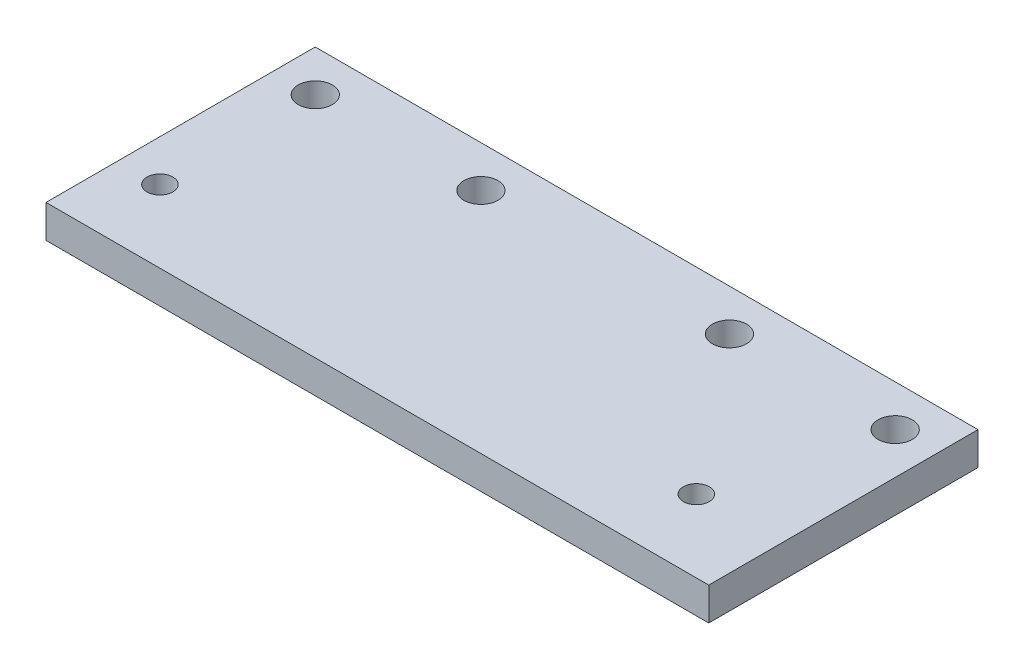
ISO-10303-21;
HEADER;
FILE_DESCRIPTION(('STEP AP214'),'2;1');
FILE_NAME('part.step','',(''),(''),'','','');
FILE_SCHEMA(('AUTOMOTIVE_DESIGN { 1 0 10303 214 1 1 1 1 }'));
ENDSEC;
DATA;
#1=APPLICATION_CONTEXT('core data for automotive mechanical design processes');
#2=APPLICATION_PROTOCOL_DEFINITION('international standard','automotive_design',2000,#1);
#3=PRODUCT_CONTEXT('',#1,'mechanical');
#4=PRODUCT('Part','Part','',(#3));
#5=PRODUCT_RELATED_PRODUCT_CATEGORY('part','',(#4));
#6=PRODUCT_DEFINITION_FORMATION('','',#4);
#7=PRODUCT_DEFINITION_CONTEXT('part definition',#1,'design');
#8=PRODUCT_DEFINITION('design','',#6,#7);
#9=PRODUCT_DEFINITION_SHAPE('','',#8);
#10=(LENGTH_UNIT() NAMED_UNIT(*) SI_UNIT(.MILLI.,.METRE.));
#11=(NAMED_UNIT(*) PLANE_ANGLE_UNIT() SI_UNIT($,.RADIAN.));
#12=(NAMED_UNIT(*) SI_UNIT($,.STERADIAN.) SOLID_ANGLE_UNIT());
#13=UNCERTAINTY_MEASURE_WITH_UNIT(LENGTH_MEASURE(1.E-05),#10,'distance_accuracy_value','');
#14=(GEOMETRIC_REPRESENTATION_CONTEXT(3) GLOBAL_UNCERTAINTY_ASSIGNED_CONTEXT((#13)) GLOBAL_UNIT_ASSIGNED_CONTEXT((#10,
#11,#12)) REPRESENTATION_CONTEXT('',''));
#15=CARTESIAN_POINT('',(0.,0.,0.));
#16=DIRECTION('',(0.,0.,1.));
#17=DIRECTION('',(1.,0.,0.));
#18=AXIS2_PLACEMENT_3D('',#15,#16,#17);
#19=CARTESIAN_POINT('',(64.,3.175,0.));
#20=DIRECTION('',(-1.,0.,0.));
#21=DIRECTION('',(0.,0.,1.));
#22=AXIS2_PLACEMENT_3D('',#19,#20,#21);
#23=PLANE('',#22);
#24=DIRECTION('',(0.,0.,-1.));
#25=VECTOR('',#24,1.);
#26=CARTESIAN_POINT('',(64.,0.,0.));
#27=LINE('',#26,#25);
#28=CARTESIAN_POINT('',(64.,0.,0.));
#29=VERTEX_POINT('',#28);
#30=CARTESIAN_POINT('',(64.,0.,-26.));
#31=VERTEX_POINT('',#30);
#32=EDGE_CURVE('E117',#29,#31,#27,.T.);
#33=ORIENTED_EDGE('',*,*,#32,.T.);
#34=DIRECTION('',(0.,-1.,0.));
#35=VECTOR('',#34,1.);
#36=CARTESIAN_POINT('',(64.,3.175,-26.));
#37=LINE('',#36,#35);
#38=CARTESIAN_POINT('',(64.,3.175,-26.));
#39=VERTEX_POINT('',#38);
#40=EDGE_CURVE('E11',#39,#31,#37,.T.);
#41=ORIENTED_EDGE('',*,*,#40,.F.);
#42=DIRECTION('',(0.,0.,-1.));
#43=VECTOR('',#42,1.);
#44=CARTESIAN_POINT('',(64.,3.175,0.));
#45=LINE('',#44,#43);
#46=CARTESIAN_POINT('',(64.,3.175,0.));
#47=VERTEX_POINT('',#46);
#48=EDGE_CURVE('E75',#47,#39,#45,.T.);
#49=ORIENTED_EDGE('',*,*,#48,.F.);
#50=DIRECTION('',(0.,-1.,0.));
#51=VECTOR('',#50,1.);
#52=CARTESIAN_POINT('',(64.,3.175,0.));
#53=LINE('',#52,#51);
#54=EDGE_CURVE('E107',#47,#29,#53,.T.);
#55=ORIENTED_EDGE('',*,*,#54,.T.);
#56=EDGE_LOOP('',(#33,#41,#49,#55));
#57=FACE_BOUND('',#56,.T.);
#58=ADVANCED_FACE('F35',(#57),#23,.F.);
#59=CARTESIAN_POINT('',(0.,3.175,-26.));
#60=DIRECTION('',(0.,0.,-1.));
#61=DIRECTION('',(-1.,0.,0.));
#62=AXIS2_PLACEMENT_3D('',#59,#60,#61);
#63=PLANE('',#62);
#64=DIRECTION('',(1.,0.,0.));
#65=VECTOR('',#64,1.);
#66=CARTESIAN_POINT('',(0.,0.,-26.));
#67=LINE('',#66,#65);
#68=CARTESIAN_POINT('',(0.,0.,-26.));
#69=VERTEX_POINT('',#68);
#70=EDGE_CURVE('E84',#69,#31,#67,.T.);
#71=ORIENTED_EDGE('',*,*,#70,.F.);
#72=DIRECTION('',(0.,-1.,0.));
#73=VECTOR('',#72,1.);
#74=CARTESIAN_POINT('',(0.,3.175,-26.));
#75=LINE('',#74,#73);
#76=CARTESIAN_POINT('',(0.,3.175,-26.));
#77=VERTEX_POINT('',#76);
#78=EDGE_CURVE('E44',#77,#69,#75,.T.);
#79=ORIENTED_EDGE('',*,*,#78,.F.);
#80=DIRECTION('',(1.,0.,0.));
#81=VECTOR('',#80,1.);
#82=CARTESIAN_POINT('',(0.,3.175,-26.));
#83=LINE('',#82,#81);
#84=EDGE_CURVE('E82',#77,#39,#83,.T.);
#85=ORIENTED_EDGE('',*,*,#84,.T.);
#86=ORIENTED_EDGE('',*,*,#40,.T.);
#87=EDGE_LOOP('',(#71,#79,#85,#86));
#88=FACE_BOUND('',#87,.T.);
#89=ADVANCED_FACE('F81',(#88),#63,.T.);
#90=CARTESIAN_POINT('',(0.,3.175,0.));
#91=DIRECTION('',(-1.,0.,0.));
#92=DIRECTION('',(0.,0.,1.));
#93=AXIS2_PLACEMENT_3D('',#90,#91,#92);
#94=PLANE('',#93);
#95=DIRECTION('',(0.,0.,-1.));
#96=VECTOR('',#95,1.);
#97=CARTESIAN_POINT('',(0.,0.,0.));
#98=LINE('',#97,#96);
#99=CARTESIAN_POINT('',(0.,0.,0.));
#100=VERTEX_POINT('',#99);
#101=EDGE_CURVE('E121',#100,#69,#98,.T.);
#102=ORIENTED_EDGE('',*,*,#101,.F.);
#103=DIRECTION('',(0.,-1.,0.));
#104=VECTOR('',#103,1.);
#105=CARTESIAN_POINT('',(0.,3.175,0.));
#106=LINE('',#105,#104);
#107=CARTESIAN_POINT('',(0.,3.175,0.));
#108=VERTEX_POINT('',#107);
#109=EDGE_CURVE('E67',#108,#100,#106,.T.);
#110=ORIENTED_EDGE('',*,*,#109,.F.);
#111=DIRECTION('',(0.,0.,-1.));
#112=VECTOR('',#111,1.);
#113=CARTESIAN_POINT('',(0.,3.175,0.));
#114=LINE('',#113,#112);
#115=EDGE_CURVE('E91',#108,#77,#114,.T.);
#116=ORIENTED_EDGE('',*,*,#115,.T.);
#117=ORIENTED_EDGE('',*,*,#78,.T.);
#118=EDGE_LOOP('',(#102,#110,#116,#117));
#119=FACE_BOUND('',#118,.T.);
#120=ADVANCED_FACE('F93',(#119),#94,.T.);
#121=CARTESIAN_POINT('',(4.,3.175,-7.));
#122=DIRECTION('',(0.,-1.,0.));
#123=DIRECTION('',(0.,0.,-1.));
#124=AXIS2_PLACEMENT_3D('',#121,#122,#123);
#125=CYLINDRICAL_SURFACE('',#124,1.25);
#126=CARTESIAN_POINT('',(4.,3.175,-7.));
#127=DIRECTION('',(0.,1.,0.));
#128=DIRECTION('',(0.,0.,1.));
#129=AXIS2_PLACEMENT_3D('',#126,#127,#128);
#130=CIRCLE('',#129,1.25);
#131=CARTESIAN_POINT('',(4.,3.175,-5.75));
#132=VERTEX_POINT('',#131);
#133=EDGE_CURVE('E101',#132,#132,#130,.T.);
#134=ORIENTED_EDGE('',*,*,#133,.T.);
#135=EDGE_LOOP('',(#134));
#136=FACE_BOUND('',#135,.T.);
#137=CARTESIAN_POINT('',(4.,0.,-7.));
#138=DIRECTION('',(0.,1.,0.));
#139=DIRECTION('',(0.,0.,1.));
#140=AXIS2_PLACEMENT_3D('',#137,#138,#139);
#141=CIRCLE('',#140,1.25);
#142=CARTESIAN_POINT('',(4.,0.,-5.75));
#143=VERTEX_POINT('',#142);
#144=EDGE_CURVE('E127',#143,#143,#141,.T.);
#145=ORIENTED_EDGE('',*,*,#144,.F.);
#146=EDGE_LOOP('',(#145));
#147=FACE_BOUND('',#146,.T.);
#148=ADVANCED_FACE('F257',(#136,#147),#125,.F.);
#149=CARTESIAN_POINT('',(55.8,3.175,-7.));
#150=DIRECTION('',(0.,-1.,0.));
#151=DIRECTION('',(0.,0.,-1.));
#152=AXIS2_PLACEMENT_3D('',#149,#150,#151);
#153=CYLINDRICAL_SURFACE('',#152,1.25);
#154=CARTESIAN_POINT('',(55.8,3.175,-7.));
#155=DIRECTION('',(0.,1.,0.));
#156=DIRECTION('',(0.,0.,1.));
#157=AXIS2_PLACEMENT_3D('',#154,#155,#156);
#158=CIRCLE('',#157,1.25);
#159=CARTESIAN_POINT('',(55.8,3.175,-5.75));
#160=VERTEX_POINT('',#159);
#161=EDGE_CURVE('E95',#160,#160,#158,.T.);
#162=ORIENTED_EDGE('',*,*,#161,.T.);
#163=EDGE_LOOP('',(#162));
#164=FACE_BOUND('',#163,.T.);
#165=CARTESIAN_POINT('',(55.8,0.,-7.));
#166=DIRECTION('',(0.,1.,0.));
#167=DIRECTION('',(0.,0.,1.));
#168=AXIS2_PLACEMENT_3D('',#165,#166,#167);
#169=CIRCLE('',#168,1.25);
#170=CARTESIAN_POINT('',(55.8,0.,-5.75));
#171=VERTEX_POINT('',#170);
#172=EDGE_CURVE('E124',#171,#171,#169,.T.);
#173=ORIENTED_EDGE('',*,*,#172,.F.);
#174=EDGE_LOOP('',(#173));
#175=FACE_BOUND('',#174,.T.);
#176=ADVANCED_FACE('F249',(#164,#175),#153,.F.);
#177=CARTESIAN_POINT('',(0.,3.175,0.));
#178=DIRECTION('',(0.,0.,-1.));
#179=DIRECTION('',(-1.,0.,0.));
#180=AXIS2_PLACEMENT_3D('',#177,#178,#179);
#181=PLANE('',#180);
#182=DIRECTION('',(1.,0.,0.));
#183=VECTOR('',#182,1.);
#184=CARTESIAN_POINT('',(0.,0.,0.));
#185=LINE('',#184,#183);
#186=EDGE_CURVE('E70',#100,#29,#185,.T.);
#187=ORIENTED_EDGE('',*,*,#186,.T.);
#188=ORIENTED_EDGE('',*,*,#54,.F.);
#189=DIRECTION('',(1.,0.,0.));
#190=VECTOR('',#189,1.);
#191=CARTESIAN_POINT('',(0.,3.175,0.));
#192=LINE('',#191,#190);
#193=EDGE_CURVE('E52',#108,#47,#192,.T.);
#194=ORIENTED_EDGE('',*,*,#193,.F.);
#195=ORIENTED_EDGE('',*,*,#109,.T.);
#196=EDGE_LOOP('',(#187,#188,#194,#195));
#197=FACE_BOUND('',#196,.T.);
#198=ADVANCED_FACE('F172',(#197),#181,.F.);
#199=CARTESIAN_POINT('',(4.,3.175,-22.));
#200=DIRECTION('',(0.,-1.,0.));
#201=DIRECTION('',(0.,0.,-1.));
#202=AXIS2_PLACEMENT_3D('',#199,#200,#201);
#203=CYLINDRICAL_SURFACE('',#202,1.65);
#204=CARTESIAN_POINT('',(4.,3.175,-22.));
#205=DIRECTION('',(0.,1.,0.));
#206=DIRECTION('',(0.,0.,1.));
#207=AXIS2_PLACEMENT_3D('',#204,#205,#206);
#208=CIRCLE('',#207,1.65);
#209=CARTESIAN_POINT('',(4.,3.175,-20.35));
#210=VERTEX_POINT('',#209);
#211=EDGE_CURVE('E188',#210,#210,#208,.T.);
#212=ORIENTED_EDGE('',*,*,#211,.T.);
#213=EDGE_LOOP('',(#212));
#214=FACE_BOUND('',#213,.T.);
#215=CARTESIAN_POINT('',(4.,0.,-22.));
#216=DIRECTION('',(0.,1.,0.));
#217=DIRECTION('',(0.,0.,1.));
#218=AXIS2_PLACEMENT_3D('',#215,#216,#217);
#219=CIRCLE('',#218,1.65);
#220=CARTESIAN_POINT('',(4.,0.,-20.35));
#221=VERTEX_POINT('',#220);
#222=EDGE_CURVE('E114',#221,#221,#219,.T.);
#223=ORIENTED_EDGE('',*,*,#222,.F.);
#224=EDGE_LOOP('',(#223));
#225=FACE_BOUND('',#224,.T.);
#226=ADVANCED_FACE('F170',(#214,#225),#203,.F.);
#227=CARTESIAN_POINT('',(20.,3.175,-22.));
#228=DIRECTION('',(0.,-1.,0.));
#229=DIRECTION('',(0.,0.,-1.));
#230=AXIS2_PLACEMENT_3D('',#227,#228,#229);
#231=CYLINDRICAL_SURFACE('',#230,1.65);
#232=CARTESIAN_POINT('',(20.,3.175,-22.));
#233=DIRECTION('',(0.,1.,0.));
#234=DIRECTION('',(0.,0.,1.));
#235=AXIS2_PLACEMENT_3D('',#232,#233,#234);
#236=CIRCLE('',#235,1.65);
#237=CARTESIAN_POINT('',(20.,3.175,-20.35));
#238=VERTEX_POINT('',#237);
#239=EDGE_CURVE('E181',#238,#238,#236,.T.);
#240=ORIENTED_EDGE('',*,*,#239,.T.);
#241=EDGE_LOOP('',(#240));
#242=FACE_BOUND('',#241,.T.);
#243=CARTESIAN_POINT('',(20.,0.,-22.));
#244=DIRECTION('',(0.,1.,0.));
#245=DIRECTION('',(0.,0.,1.));
#246=AXIS2_PLACEMENT_3D('',#243,#244,#245);
#247=CIRCLE('',#246,1.65);
#248=CARTESIAN_POINT('',(20.,0.,-20.35));
#249=VERTEX_POINT('',#248);
#250=EDGE_CURVE('E111',#249,#249,#247,.T.);
#251=ORIENTED_EDGE('',*,*,#250,.F.);
#252=EDGE_LOOP('',(#251));
#253=FACE_BOUND('',#252,.T.);
#254=ADVANCED_FACE('F159',(#242,#253),#231,.F.);
#255=CARTESIAN_POINT('',(44.,3.175,-22.));
#256=DIRECTION('',(0.,-1.,0.));
#257=DIRECTION('',(0.,0.,-1.));
#258=AXIS2_PLACEMENT_3D('',#255,#256,#257);
#259=CYLINDRICAL_SURFACE('',#258,1.65);
#260=CARTESIAN_POINT('',(44.,3.175,-22.));
#261=DIRECTION('',(0.,1.,0.));
#262=DIRECTION('',(0.,0.,1.));
#263=AXIS2_PLACEMENT_3D('',#260,#261,#262);
#264=CIRCLE('',#263,1.65);
#265=CARTESIAN_POINT('',(44.,3.175,-20.35));
#266=VERTEX_POINT('',#265);
#267=EDGE_CURVE('E133',#266,#266,#264,.T.);
#268=ORIENTED_EDGE('',*,*,#267,.T.);
#269=EDGE_LOOP('',(#268));
#270=FACE_BOUND('',#269,.T.);
#271=CARTESIAN_POINT('',(44.,0.,-22.));
#272=DIRECTION('',(0.,1.,0.));
#273=DIRECTION('',(0.,0.,1.));
#274=AXIS2_PLACEMENT_3D('',#271,#272,#273);
#275=CIRCLE('',#274,1.65);
#276=CARTESIAN_POINT('',(44.,0.,-20.35));
#277=VERTEX_POINT('',#276);
#278=EDGE_CURVE('E108',#277,#277,#275,.T.);
#279=ORIENTED_EDGE('',*,*,#278,.F.);
#280=EDGE_LOOP('',(#279));
#281=FACE_BOUND('',#280,.T.);
#282=ADVANCED_FACE('F37',(#270,#281),#259,.F.);
#283=CARTESIAN_POINT('',(60.,3.175,-22.));
#284=DIRECTION('',(0.,-1.,0.));
#285=DIRECTION('',(0.,0.,-1.));
#286=AXIS2_PLACEMENT_3D('',#283,#284,#285);
#287=CYLINDRICAL_SURFACE('',#286,1.65);
#288=CARTESIAN_POINT('',(60.,3.175,-22.));
#289=DIRECTION('',(0.,1.,0.));
#290=DIRECTION('',(0.,0.,1.));
#291=AXIS2_PLACEMENT_3D('',#288,#289,#290);
#292=CIRCLE('',#291,1.65);
#293=CARTESIAN_POINT('',(60.,3.175,-20.35));
#294=VERTEX_POINT('',#293);
#295=EDGE_CURVE('E104',#294,#294,#292,.T.);
#296=ORIENTED_EDGE('',*,*,#295,.T.);
#297=EDGE_LOOP('',(#296));
#298=FACE_BOUND('',#297,.T.);
#299=CARTESIAN_POINT('',(60.,0.,-22.));
#300=DIRECTION('',(0.,1.,0.));
#301=DIRECTION('',(0.,0.,1.));
#302=AXIS2_PLACEMENT_3D('',#299,#300,#301);
#303=CIRCLE('',#302,1.65);
#304=CARTESIAN_POINT('',(60.,0.,-20.35));
#305=VERTEX_POINT('',#304);
#306=EDGE_CURVE('E130',#305,#305,#303,.T.);
#307=ORIENTED_EDGE('',*,*,#306,.F.);
#308=EDGE_LOOP('',(#307));
#309=FACE_BOUND('',#308,.T.);
#310=ADVANCED_FACE('F149',(#298,#309),#287,.F.);
#311=CARTESIAN_POINT('',(0.,3.175,0.));
#312=DIRECTION('',(0.,1.,0.));
#313=DIRECTION('',(0.,0.,1.));
#314=AXIS2_PLACEMENT_3D('',#311,#312,#313);
#315=PLANE('',#314);
#316=ORIENTED_EDGE('',*,*,#267,.F.);
#317=EDGE_LOOP('',(#316));
#318=FACE_BOUND('',#317,.T.);
#319=ORIENTED_EDGE('',*,*,#239,.F.);
#320=EDGE_LOOP('',(#319));
#321=FACE_BOUND('',#320,.T.);
#322=ORIENTED_EDGE('',*,*,#211,.F.);
#323=EDGE_LOOP('',(#322));
#324=FACE_BOUND('',#323,.T.);
#325=ORIENTED_EDGE('',*,*,#48,.T.);
#326=ORIENTED_EDGE('',*,*,#84,.F.);
#327=ORIENTED_EDGE('',*,*,#115,.F.);
#328=ORIENTED_EDGE('',*,*,#193,.T.);
#329=EDGE_LOOP('',(#325,#326,#327,#328));
#330=FACE_BOUND('',#329,.T.);
#331=ORIENTED_EDGE('',*,*,#161,.F.);
#332=EDGE_LOOP('',(#331));
#333=FACE_BOUND('',#332,.T.);
#334=ORIENTED_EDGE('',*,*,#133,.F.);
#335=EDGE_LOOP('',(#334));
#336=FACE_BOUND('',#335,.T.);
#337=ORIENTED_EDGE('',*,*,#295,.F.);
#338=EDGE_LOOP('',(#337));
#339=FACE_BOUND('',#338,.T.);
#340=ADVANCED_FACE('F89',(#318,#321,#324,#330,#333,#336,#339),#315,.T.);
#341=CARTESIAN_POINT('',(0.,0.,0.));
#342=DIRECTION('',(0.,1.,0.));
#343=DIRECTION('',(0.,0.,1.));
#344=AXIS2_PLACEMENT_3D('',#341,#342,#343);
#345=PLANE('',#344);
#346=ORIENTED_EDGE('',*,*,#278,.T.);
#347=EDGE_LOOP('',(#346));
#348=FACE_BOUND('',#347,.T.);
#349=ORIENTED_EDGE('',*,*,#250,.T.);
#350=EDGE_LOOP('',(#349));
#351=FACE_BOUND('',#350,.T.);
#352=ORIENTED_EDGE('',*,*,#222,.T.);
#353=EDGE_LOOP('',(#352));
#354=FACE_BOUND('',#353,.T.);
#355=ORIENTED_EDGE('',*,*,#32,.F.);
#356=ORIENTED_EDGE('',*,*,#186,.F.);
#357=ORIENTED_EDGE('',*,*,#101,.T.);
#358=ORIENTED_EDGE('',*,*,#70,.T.);
#359=EDGE_LOOP('',(#355,#356,#357,#358));
#360=FACE_BOUND('',#359,.T.);
#361=ORIENTED_EDGE('',*,*,#172,.T.);
#362=EDGE_LOOP('',(#361));
#363=FACE_BOUND('',#362,.T.);
#364=ORIENTED_EDGE('',*,*,#144,.T.);
#365=EDGE_LOOP('',(#364));
#366=FACE_BOUND('',#365,.T.);
#367=ORIENTED_EDGE('',*,*,#306,.T.);
#368=EDGE_LOOP('',(#367));
#369=FACE_BOUND('',#368,.T.);
#370=ADVANCED_FACE('F138',(#348,#351,#354,#360,#363,#366,#369),#345,.F.);
#371=CLOSED_SHELL('',(#58,#89,#120,#148,#176,#198,#226,#254,#282,#310,#340,#370));
#372=MANIFOLD_SOLID_BREP('B2',#371);
#373=ADVANCED_BREP_SHAPE_REPRESENTATION('',(#18,#372),#14);
#374=SHAPE_DEFINITION_REPRESENTATION(#9,#373);
ENDSEC;
END-ISO-10303-21;
